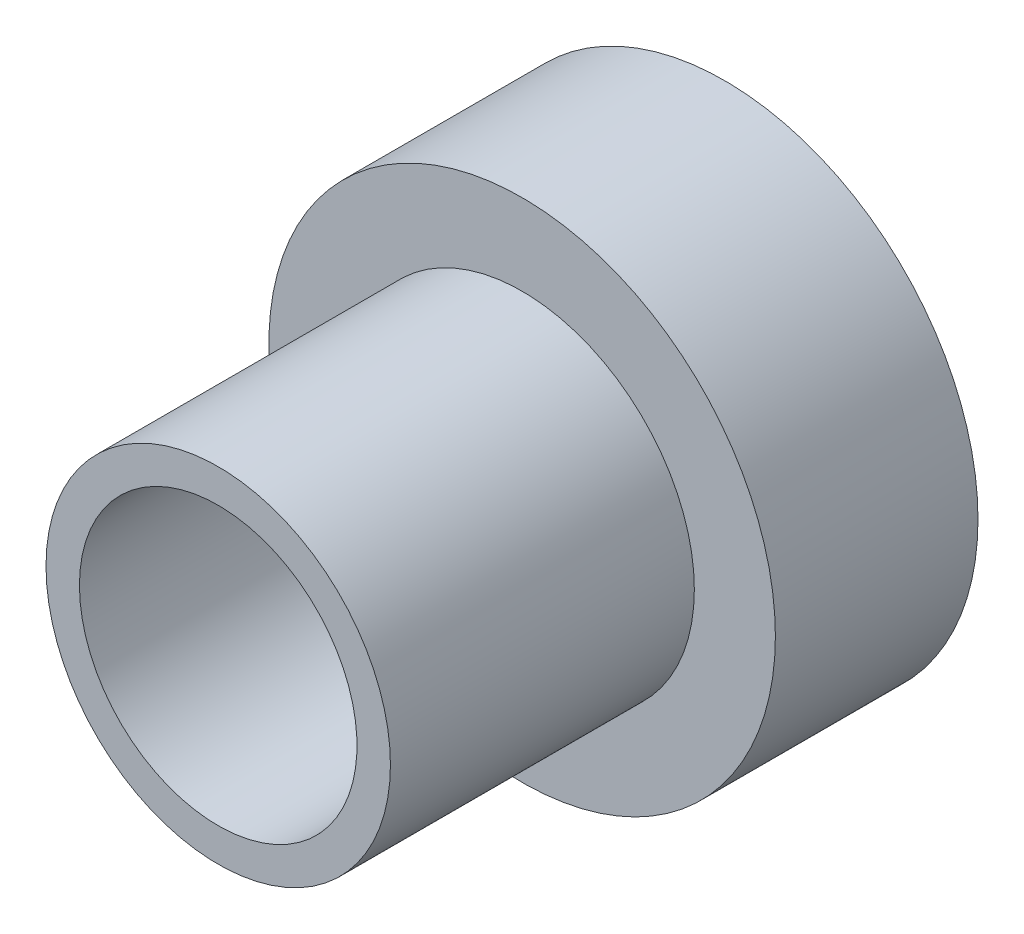
ISO-10303-21;
HEADER;
FILE_DESCRIPTION(('STEP AP214'),'2;1');
FILE_NAME('part.step','',(''),(''),'','','');
FILE_SCHEMA(('AUTOMOTIVE_DESIGN { 1 0 10303 214 1 1 1 1 }'));
ENDSEC;
DATA;
#1=APPLICATION_CONTEXT('core data for automotive mechanical design processes');
#2=APPLICATION_PROTOCOL_DEFINITION('international standard','automotive_design',2000,#1);
#3=PRODUCT_CONTEXT('',#1,'mechanical');
#4=PRODUCT('Part','Part','',(#3));
#5=PRODUCT_RELATED_PRODUCT_CATEGORY('part','',(#4));
#6=PRODUCT_DEFINITION_FORMATION('','',#4);
#7=PRODUCT_DEFINITION_CONTEXT('part definition',#1,'design');
#8=PRODUCT_DEFINITION('design','',#6,#7);
#9=PRODUCT_DEFINITION_SHAPE('','',#8);
#10=(LENGTH_UNIT() NAMED_UNIT(*) SI_UNIT(.MILLI.,.METRE.));
#11=(NAMED_UNIT(*) PLANE_ANGLE_UNIT() SI_UNIT($,.RADIAN.));
#12=(NAMED_UNIT(*) SI_UNIT($,.STERADIAN.) SOLID_ANGLE_UNIT());
#13=UNCERTAINTY_MEASURE_WITH_UNIT(LENGTH_MEASURE(1.E-05),#10,'distance_accuracy_value','');
#14=(GEOMETRIC_REPRESENTATION_CONTEXT(3) GLOBAL_UNCERTAINTY_ASSIGNED_CONTEXT((#13)) GLOBAL_UNIT_ASSIGNED_CONTEXT((#10,
#11,#12)) REPRESENTATION_CONTEXT('',''));
#15=CARTESIAN_POINT('',(0.,0.,0.));
#16=DIRECTION('',(0.,0.,1.));
#17=DIRECTION('',(1.,0.,0.));
#18=AXIS2_PLACEMENT_3D('',#15,#16,#17);
#19=CARTESIAN_POINT('',(0.,0.,12.5));
#20=DIRECTION('',(0.,0.,-1.));
#21=DIRECTION('',(-1.,0.,0.));
#22=AXIS2_PLACEMENT_3D('',#19,#20,#21);
#23=CYLINDRICAL_SURFACE('',#22,12.5);
#24=CARTESIAN_POINT('',(0.,0.,-12.5));
#25=DIRECTION('',(0.,0.,1.));
#26=DIRECTION('',(1.,0.,0.));
#27=AXIS2_PLACEMENT_3D('',#24,#25,#26);
#28=CIRCLE('',#27,12.5);
#29=CARTESIAN_POINT('',(12.5,0.,-12.5));
#30=VERTEX_POINT('',#29);
#31=EDGE_CURVE('E11',#30,#30,#28,.T.);
#32=ORIENTED_EDGE('',*,*,#31,.T.);
#33=EDGE_LOOP('',(#32));
#34=FACE_BOUND('',#33,.T.);
#35=CARTESIAN_POINT('',(0.,0.,-2.5));
#36=DIRECTION('',(0.,0.,1.));
#37=DIRECTION('',(1.,0.,0.));
#38=AXIS2_PLACEMENT_3D('',#35,#36,#37);
#39=CIRCLE('',#38,12.5);
#40=CARTESIAN_POINT('',(12.5,0.,-2.5));
#41=VERTEX_POINT('',#40);
#42=EDGE_CURVE('E39',#41,#41,#39,.T.);
#43=ORIENTED_EDGE('',*,*,#42,.F.);
#44=EDGE_LOOP('',(#43));
#45=FACE_BOUND('',#44,.T.);
#46=ADVANCED_FACE('F36',(#34,#45),#23,.T.);
#47=CARTESIAN_POINT('',(0.,0.,12.5));
#48=DIRECTION('',(0.,0.,1.));
#49=DIRECTION('',(1.,0.,0.));
#50=AXIS2_PLACEMENT_3D('',#47,#48,#49);
#51=PLANE('',#50);
#52=CARTESIAN_POINT('',(0.,0.,12.5));
#53=DIRECTION('',(0.,0.,-1.));
#54=DIRECTION('',(-1.,0.,0.));
#55=AXIS2_PLACEMENT_3D('',#52,#53,#54);
#56=CIRCLE('',#55,6.85);
#57=CARTESIAN_POINT('',(-6.85,0.,12.5));
#58=VERTEX_POINT('',#57);
#59=EDGE_CURVE('E43',#58,#58,#56,.T.);
#60=ORIENTED_EDGE('',*,*,#59,.T.);
#61=EDGE_LOOP('',(#60));
#62=FACE_BOUND('',#61,.T.);
#63=CARTESIAN_POINT('',(0.,0.,12.5));
#64=DIRECTION('',(0.,0.,1.));
#65=DIRECTION('',(1.,0.,0.));
#66=AXIS2_PLACEMENT_3D('',#63,#64,#65);
#67=CIRCLE('',#66,8.5);
#68=CARTESIAN_POINT('',(8.5,0.,12.5));
#69=VERTEX_POINT('',#68);
#70=EDGE_CURVE('E52',#69,#69,#67,.T.);
#71=ORIENTED_EDGE('',*,*,#70,.T.);
#72=EDGE_LOOP('',(#71));
#73=FACE_BOUND('',#72,.T.);
#74=ADVANCED_FACE('F65',(#62,#73),#51,.T.);
#75=CARTESIAN_POINT('',(0.,0.,-12.5));
#76=DIRECTION('',(0.,0.,1.));
#77=DIRECTION('',(1.,0.,0.));
#78=AXIS2_PLACEMENT_3D('',#75,#76,#77);
#79=PLANE('',#78);
#80=CARTESIAN_POINT('',(0.,0.,-12.5));
#81=DIRECTION('',(0.,0.,-1.));
#82=DIRECTION('',(-1.,0.,0.));
#83=AXIS2_PLACEMENT_3D('',#80,#81,#82);
#84=CIRCLE('',#83,6.85);
#85=CARTESIAN_POINT('',(-6.85,0.,-12.5));
#86=VERTEX_POINT('',#85);
#87=EDGE_CURVE('E47',#86,#86,#84,.T.);
#88=ORIENTED_EDGE('',*,*,#87,.F.);
#89=EDGE_LOOP('',(#88));
#90=FACE_BOUND('',#89,.T.);
#91=ORIENTED_EDGE('',*,*,#31,.F.);
#92=EDGE_LOOP('',(#91));
#93=FACE_BOUND('',#92,.T.);
#94=ADVANCED_FACE('F69',(#90,#93),#79,.F.);
#95=CARTESIAN_POINT('',(0.,0.,12.5));
#96=DIRECTION('',(0.,0.,-1.));
#97=DIRECTION('',(-1.,0.,0.));
#98=AXIS2_PLACEMENT_3D('',#95,#96,#97);
#99=CYLINDRICAL_SURFACE('',#98,6.85);
#100=ORIENTED_EDGE('',*,*,#59,.F.);
#101=EDGE_LOOP('',(#100));
#102=FACE_BOUND('',#101,.T.);
#103=ORIENTED_EDGE('',*,*,#87,.T.);
#104=EDGE_LOOP('',(#103));
#105=FACE_BOUND('',#104,.T.);
#106=ADVANCED_FACE('F75',(#102,#105),#99,.F.);
#107=CARTESIAN_POINT('',(0.,0.,-2.5));
#108=DIRECTION('',(0.,0.,1.));
#109=DIRECTION('',(1.,0.,0.));
#110=AXIS2_PLACEMENT_3D('',#107,#108,#109);
#111=PLANE('',#110);
#112=CARTESIAN_POINT('',(0.,0.,-2.5));
#113=DIRECTION('',(0.,0.,1.));
#114=DIRECTION('',(1.,0.,0.));
#115=AXIS2_PLACEMENT_3D('',#112,#113,#114);
#116=CIRCLE('',#115,8.5);
#117=CARTESIAN_POINT('',(8.5,0.,-2.5));
#118=VERTEX_POINT('',#117);
#119=EDGE_CURVE('E55',#118,#118,#116,.T.);
#120=ORIENTED_EDGE('',*,*,#119,.F.);
#121=EDGE_LOOP('',(#120));
#122=FACE_BOUND('',#121,.T.);
#123=ORIENTED_EDGE('',*,*,#42,.T.);
#124=EDGE_LOOP('',(#123));
#125=FACE_BOUND('',#124,.T.);
#126=ADVANCED_FACE('F62',(#122,#125),#111,.T.);
#127=CARTESIAN_POINT('',(0.,0.,-2.5));
#128=DIRECTION('',(0.,0.,1.));
#129=DIRECTION('',(1.,0.,0.));
#130=AXIS2_PLACEMENT_3D('',#127,#128,#129);
#131=CYLINDRICAL_SURFACE('',#130,8.5);
#132=ORIENTED_EDGE('',*,*,#119,.T.);
#133=EDGE_LOOP('',(#132));
#134=FACE_BOUND('',#133,.T.);
#135=ORIENTED_EDGE('',*,*,#70,.F.);
#136=EDGE_LOOP('',(#135));
#137=FACE_BOUND('',#136,.T.);
#138=ADVANCED_FACE('F84',(#134,#137),#131,.T.);
#139=CLOSED_SHELL('',(#46,#74,#94,#106,#126,#138));
#140=MANIFOLD_SOLID_BREP('B2',#139);
#141=ADVANCED_BREP_SHAPE_REPRESENTATION('',(#18,#140),#14);
#142=SHAPE_DEFINITION_REPRESENTATION(#9,#141);
ENDSEC;
END-ISO-10303-21;
